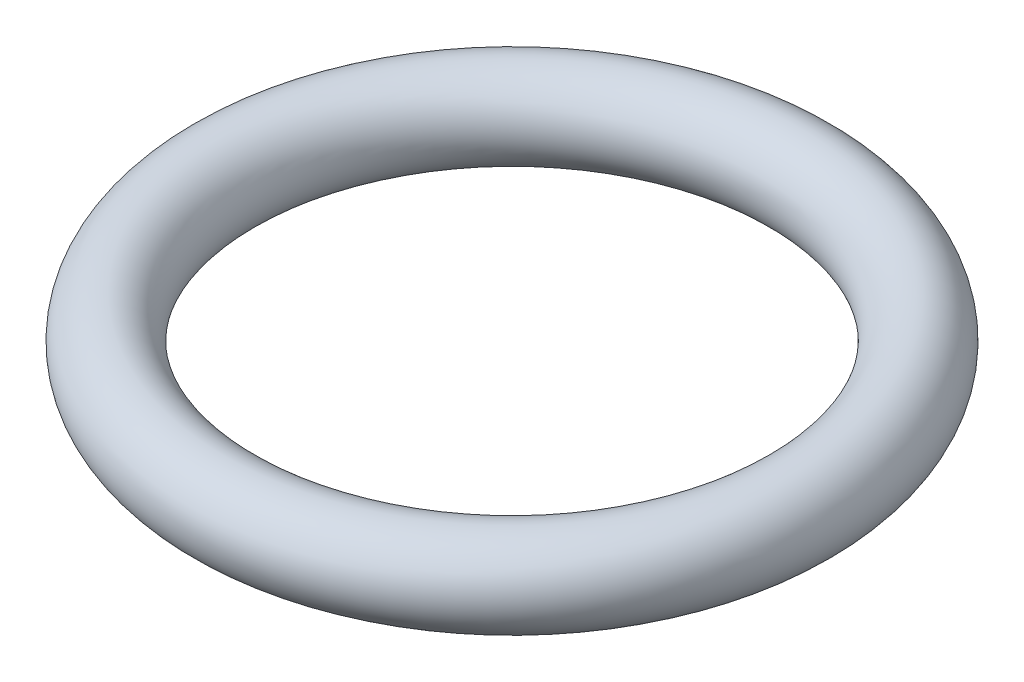
ISO-10303-21;
HEADER;
FILE_DESCRIPTION(('STEP AP214'),'2;1');
FILE_NAME('part.step','',(''),(''),'','','');
FILE_SCHEMA(('AUTOMOTIVE_DESIGN { 1 0 10303 214 1 1 1 1 }'));
ENDSEC;
DATA;
#1=APPLICATION_CONTEXT('core data for automotive mechanical design processes');
#2=APPLICATION_PROTOCOL_DEFINITION('international standard','automotive_design',2000,#1);
#3=PRODUCT_CONTEXT('',#1,'mechanical');
#4=PRODUCT('Part','Part','',(#3));
#5=PRODUCT_RELATED_PRODUCT_CATEGORY('part','',(#4));
#6=PRODUCT_DEFINITION_FORMATION('','',#4);
#7=PRODUCT_DEFINITION_CONTEXT('part definition',#1,'design');
#8=PRODUCT_DEFINITION('design','',#6,#7);
#9=PRODUCT_DEFINITION_SHAPE('','',#8);
#10=(LENGTH_UNIT() NAMED_UNIT(*) SI_UNIT(.MILLI.,.METRE.));
#11=(NAMED_UNIT(*) PLANE_ANGLE_UNIT() SI_UNIT($,.RADIAN.));
#12=(NAMED_UNIT(*) SI_UNIT($,.STERADIAN.) SOLID_ANGLE_UNIT());
#13=UNCERTAINTY_MEASURE_WITH_UNIT(LENGTH_MEASURE(1.E-05),#10,'distance_accuracy_value','');
#14=(GEOMETRIC_REPRESENTATION_CONTEXT(3) GLOBAL_UNCERTAINTY_ASSIGNED_CONTEXT((#13)) GLOBAL_UNIT_ASSIGNED_CONTEXT((#10,
#11,#12)) REPRESENTATION_CONTEXT('',''));
#15=CARTESIAN_POINT('',(0.,0.,0.));
#16=DIRECTION('',(0.,0.,1.));
#17=DIRECTION('',(1.,0.,0.));
#18=AXIS2_PLACEMENT_3D('',#15,#16,#17);
#19=CARTESIAN_POINT('',(0.,0.,0.));
#20=DIRECTION('',(0.,-1.,0.));
#21=DIRECTION('',(1.,0.,0.));
#22=AXIS2_PLACEMENT_3D('',#19,#20,#21);
#23=TOROIDAL_SURFACE('',#22,5.3848,0.79375);
#24=CARTESIAN_POINT('',(6.17855,0.,0.));
#25=VERTEX_POINT('',#24);
#26=VERTEX_LOOP('',#25);
#27=FACE_BOUND('',#26,.T.);
#28=ADVANCED_FACE('F28',(#27),#23,.T.);
#29=CLOSED_SHELL('',(#28));
#30=MANIFOLD_SOLID_BREP('B2',#29);
#31=ADVANCED_BREP_SHAPE_REPRESENTATION('',(#18,#30),#14);
#32=SHAPE_DEFINITION_REPRESENTATION(#9,#31);
ENDSEC;
END-ISO-10303-21;
